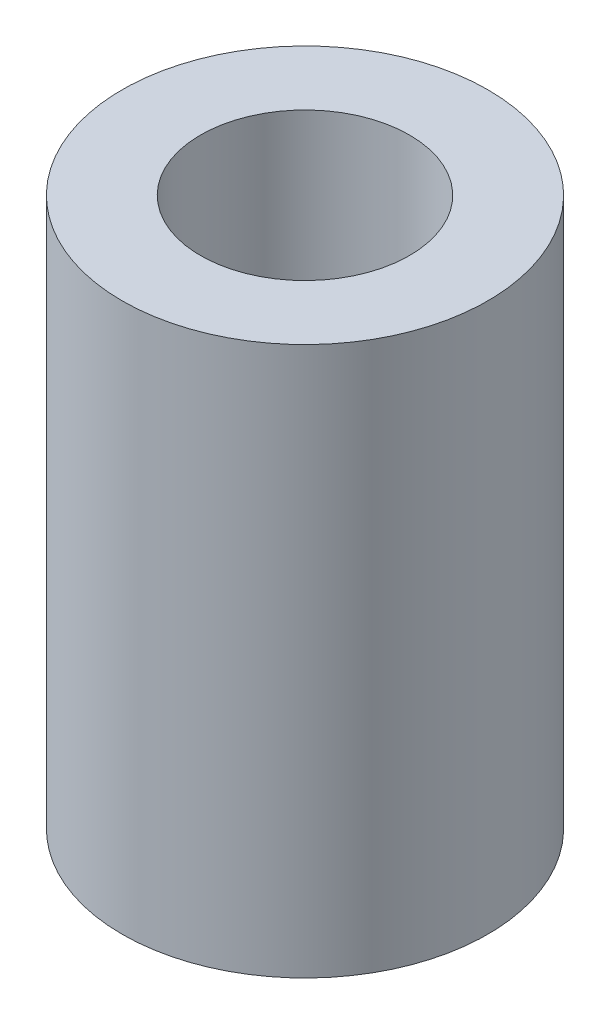
ISO-10303-21;
HEADER;
FILE_DESCRIPTION(('STEP AP214'),'2;1');
FILE_NAME('part.step','',(''),(''),'','','');
FILE_SCHEMA(('AUTOMOTIVE_DESIGN { 1 0 10303 214 1 1 1 1 }'));
ENDSEC;
DATA;
#1=APPLICATION_CONTEXT('core data for automotive mechanical design processes');
#2=APPLICATION_PROTOCOL_DEFINITION('international standard','automotive_design',2000,#1);
#3=PRODUCT_CONTEXT('',#1,'mechanical');
#4=PRODUCT('Part','Part','',(#3));
#5=PRODUCT_RELATED_PRODUCT_CATEGORY('part','',(#4));
#6=PRODUCT_DEFINITION_FORMATION('','',#4);
#7=PRODUCT_DEFINITION_CONTEXT('part definition',#1,'design');
#8=PRODUCT_DEFINITION('design','',#6,#7);
#9=PRODUCT_DEFINITION_SHAPE('','',#8);
#10=(LENGTH_UNIT() NAMED_UNIT(*) SI_UNIT(.MILLI.,.METRE.));
#11=(NAMED_UNIT(*) PLANE_ANGLE_UNIT() SI_UNIT($,.RADIAN.));
#12=(NAMED_UNIT(*) SI_UNIT($,.STERADIAN.) SOLID_ANGLE_UNIT());
#13=UNCERTAINTY_MEASURE_WITH_UNIT(LENGTH_MEASURE(1.E-05),#10,'distance_accuracy_value','');
#14=(GEOMETRIC_REPRESENTATION_CONTEXT(3) GLOBAL_UNCERTAINTY_ASSIGNED_CONTEXT((#13)) GLOBAL_UNIT_ASSIGNED_CONTEXT((#10,
#11,#12)) REPRESENTATION_CONTEXT('',''));
#15=CARTESIAN_POINT('',(0.,0.,0.));
#16=DIRECTION('',(0.,0.,1.));
#17=DIRECTION('',(1.,0.,0.));
#18=AXIS2_PLACEMENT_3D('',#15,#16,#17);
#19=CARTESIAN_POINT('',(0.,10.5,0.));
#20=DIRECTION('',(0.,1.,0.));
#21=DIRECTION('',(0.,0.,1.));
#22=AXIS2_PLACEMENT_3D('',#19,#20,#21);
#23=PLANE('',#22);
#24=CARTESIAN_POINT('',(0.,10.5,0.));
#25=DIRECTION('',(0.,1.,0.));
#26=DIRECTION('',(0.,0.,1.));
#27=AXIS2_PLACEMENT_3D('',#24,#25,#26);
#28=CIRCLE('',#27,3.5);
#29=CARTESIAN_POINT('',(0.,10.5,-3.5));
#30=VERTEX_POINT('',#29);
#31=EDGE_CURVE('E10',#30,#30,#28,.T.);
#32=ORIENTED_EDGE('',*,*,#31,.T.);
#33=EDGE_LOOP('',(#32));
#34=FACE_BOUND('',#33,.T.);
#35=CARTESIAN_POINT('',(0.,10.5,0.));
#36=DIRECTION('',(0.,1.,0.));
#37=DIRECTION('',(0.,0.,1.));
#38=AXIS2_PLACEMENT_3D('',#35,#36,#37);
#39=CIRCLE('',#38,2.);
#40=CARTESIAN_POINT('',(0.,10.5,-2.));
#41=VERTEX_POINT('',#40);
#42=EDGE_CURVE('E53',#41,#41,#39,.T.);
#43=ORIENTED_EDGE('',*,*,#42,.F.);
#44=EDGE_LOOP('',(#43));
#45=FACE_BOUND('',#44,.T.);
#46=ADVANCED_FACE('F40',(#34,#45),#23,.T.);
#47=CARTESIAN_POINT('',(0.,0.,0.));
#48=DIRECTION('',(0.,1.,0.));
#49=DIRECTION('',(0.,0.,1.));
#50=AXIS2_PLACEMENT_3D('',#47,#48,#49);
#51=PLANE('',#50);
#52=CARTESIAN_POINT('',(0.,0.,0.));
#53=DIRECTION('',(0.,1.,0.));
#54=DIRECTION('',(0.,0.,1.));
#55=AXIS2_PLACEMENT_3D('',#52,#53,#54);
#56=CIRCLE('',#55,3.5);
#57=CARTESIAN_POINT('',(0.,0.,-3.5));
#58=VERTEX_POINT('',#57);
#59=EDGE_CURVE('E44',#58,#58,#56,.T.);
#60=ORIENTED_EDGE('',*,*,#59,.F.);
#61=EDGE_LOOP('',(#60));
#62=FACE_BOUND('',#61,.T.);
#63=CARTESIAN_POINT('',(0.,0.,0.));
#64=DIRECTION('',(0.,1.,0.));
#65=DIRECTION('',(0.,0.,1.));
#66=AXIS2_PLACEMENT_3D('',#63,#64,#65);
#67=CIRCLE('',#66,2.);
#68=CARTESIAN_POINT('',(0.,0.,-2.));
#69=VERTEX_POINT('',#68);
#70=EDGE_CURVE('E55',#69,#69,#67,.T.);
#71=ORIENTED_EDGE('',*,*,#70,.T.);
#72=EDGE_LOOP('',(#71));
#73=FACE_BOUND('',#72,.T.);
#74=ADVANCED_FACE('F67',(#62,#73),#51,.F.);
#75=CARTESIAN_POINT('',(0.,10.5,0.));
#76=DIRECTION('',(0.,-1.,0.));
#77=DIRECTION('',(0.,0.,-1.));
#78=AXIS2_PLACEMENT_3D('',#75,#76,#77);
#79=CYLINDRICAL_SURFACE('',#78,3.5);
#80=CARTESIAN_POINT('',(0.,10.5,-3.5));
#81=CARTESIAN_POINT('',(0.,10.390625,-3.5));
#82=CARTESIAN_POINT('',(0.,10.28125,-3.5));
#83=CARTESIAN_POINT('',(0.,10.0625,-3.5));
#84=CARTESIAN_POINT('',(0.,9.953125,-3.5));
#85=CARTESIAN_POINT('',(0.,9.734375,-3.5));
#86=CARTESIAN_POINT('',(0.,9.625,-3.5));
#87=CARTESIAN_POINT('',(0.,9.40625,-3.5));
#88=CARTESIAN_POINT('',(0.,9.296875,-3.5));
#89=CARTESIAN_POINT('',(0.,9.078125,-3.5));
#90=CARTESIAN_POINT('',(0.,8.96875,-3.5));
#91=CARTESIAN_POINT('',(0.,8.75,-3.5));
#92=CARTESIAN_POINT('',(0.,8.640625,-3.5));
#93=CARTESIAN_POINT('',(0.,8.421875,-3.5));
#94=CARTESIAN_POINT('',(0.,8.3125,-3.5));
#95=CARTESIAN_POINT('',(0.,8.09375,-3.5));
#96=CARTESIAN_POINT('',(0.,7.984375,-3.5));
#97=CARTESIAN_POINT('',(0.,7.765625,-3.5));
#98=CARTESIAN_POINT('',(0.,7.65625,-3.5));
#99=CARTESIAN_POINT('',(0.,7.4375,-3.5));
#100=CARTESIAN_POINT('',(0.,7.328125,-3.5));
#101=CARTESIAN_POINT('',(0.,7.109375,-3.5));
#102=CARTESIAN_POINT('',(0.,7.,-3.5));
#103=CARTESIAN_POINT('',(0.,6.78125,-3.5));
#104=CARTESIAN_POINT('',(0.,6.671875,-3.5));
#105=CARTESIAN_POINT('',(0.,6.453125,-3.5));
#106=CARTESIAN_POINT('',(0.,6.34375,-3.5));
#107=CARTESIAN_POINT('',(0.,6.125,-3.5));
#108=CARTESIAN_POINT('',(0.,6.015625,-3.5));
#109=CARTESIAN_POINT('',(0.,5.796875,-3.5));
#110=CARTESIAN_POINT('',(0.,5.6875,-3.5));
#111=CARTESIAN_POINT('',(0.,5.46875,-3.5));
#112=CARTESIAN_POINT('',(0.,5.359375,-3.5));
#113=CARTESIAN_POINT('',(0.,5.140625,-3.5));
#114=CARTESIAN_POINT('',(0.,5.03125,-3.5));
#115=CARTESIAN_POINT('',(0.,4.8125,-3.5));
#116=CARTESIAN_POINT('',(0.,4.703125,-3.5));
#117=CARTESIAN_POINT('',(0.,4.484375,-3.5));
#118=CARTESIAN_POINT('',(0.,4.375,-3.5));
#119=CARTESIAN_POINT('',(0.,4.15625,-3.5));
#120=CARTESIAN_POINT('',(0.,4.046875,-3.5));
#121=CARTESIAN_POINT('',(0.,3.828125,-3.5));
#122=CARTESIAN_POINT('',(0.,3.71875,-3.5));
#123=CARTESIAN_POINT('',(0.,3.5,-3.5));
#124=CARTESIAN_POINT('',(0.,3.390625,-3.5));
#125=CARTESIAN_POINT('',(0.,3.171875,-3.5));
#126=CARTESIAN_POINT('',(0.,3.0625,-3.5));
#127=CARTESIAN_POINT('',(0.,2.84375,-3.5));
#128=CARTESIAN_POINT('',(0.,2.734375,-3.5));
#129=CARTESIAN_POINT('',(0.,2.515625,-3.5));
#130=CARTESIAN_POINT('',(0.,2.40625,-3.5));
#131=CARTESIAN_POINT('',(0.,2.1875,-3.5));
#132=CARTESIAN_POINT('',(0.,2.078125,-3.5));
#133=CARTESIAN_POINT('',(0.,1.859375,-3.5));
#134=CARTESIAN_POINT('',(0.,1.75,-3.5));
#135=CARTESIAN_POINT('',(0.,1.53125,-3.5));
#136=CARTESIAN_POINT('',(0.,1.421875,-3.5));
#137=CARTESIAN_POINT('',(0.,1.203125,-3.5));
#138=CARTESIAN_POINT('',(0.,1.09375,-3.5));
#139=CARTESIAN_POINT('',(0.,0.875000000000001,-3.5));
#140=CARTESIAN_POINT('',(0.,0.765625000000001,-3.5));
#141=CARTESIAN_POINT('',(0.,0.546875,-3.5));
#142=CARTESIAN_POINT('',(0.,0.4375,-3.5));
#143=CARTESIAN_POINT('',(0.,0.21875,-3.5));
#144=CARTESIAN_POINT('',(0.,0.109375,-3.5));
#145=CARTESIAN_POINT('',(0.,0.,-3.5));
#146=B_SPLINE_CURVE_WITH_KNOTS('',3,(#80,#81,#82,#83,#84,#85,#86,#87,#88,#89,#90,#91,#92,#93,
#94,#95,#96,#97,#98,#99,#100,#101,#102,#103,#104,#105,#106,#107,#108,#109,#110,#111,#112,#113,
#114,#115,#116,#117,#118,#119,#120,#121,#122,#123,#124,#125,#126,#127,#128,#129,#130,#131,#132,
#133,#134,#135,#136,#137,#138,#139,#140,#141,#142,#143,#144,#145),.UNSPECIFIED.,.F.,.F.,(4,2,2,
2,2,2,2,2,2,2,2,2,2,2,2,2,2,2,2,2,2,2,2,2,2,2,2,2,2,2,2,2,4),(0.,0.328124999999999,
0.656249999999999,0.984374999999999,1.3125,1.640625,1.96875,2.296875,2.625,2.953125,3.28125,
3.609375,3.9375,4.265625,4.59375,4.921875,5.25,5.578125,5.90625,6.234375,6.5625,6.890625,
7.21875,7.546875,7.875,8.203125,8.53125,8.859375,9.1875,9.515625,9.84375,10.171875,10.5),.UNSPECIFIED.);
#147=EDGE_CURVE('BSEAM42',#30,#58,#146,.T.);
#148=ORIENTED_EDGE('',*,*,#31,.F.);
#149=ORIENTED_EDGE('',*,*,#59,.T.);
#150=ORIENTED_EDGE('',*,*,#147,.T.);
#151=ORIENTED_EDGE('',*,*,#147,.F.);
#152=EDGE_LOOP('',(#148,#150,#149,#151));
#153=FACE_BOUND('',#152,.T.);
#154=ADVANCED_FACE('F42',(#153),#79,.T.);
#155=CARTESIAN_POINT('',(0.,10.5,0.));
#156=DIRECTION('',(0.,-1.,0.));
#157=DIRECTION('',(0.,0.,-1.));
#158=AXIS2_PLACEMENT_3D('',#155,#156,#157);
#159=CYLINDRICAL_SURFACE('',#158,2.);
#160=CARTESIAN_POINT('',(0.,10.5,-2.));
#161=CARTESIAN_POINT('',(0.,10.390625,-2.));
#162=CARTESIAN_POINT('',(0.,10.28125,-2.));
#163=CARTESIAN_POINT('',(0.,10.0625,-2.));
#164=CARTESIAN_POINT('',(0.,9.953125,-2.));
#165=CARTESIAN_POINT('',(0.,9.734375,-2.));
#166=CARTESIAN_POINT('',(0.,9.625,-2.));
#167=CARTESIAN_POINT('',(0.,9.40625,-2.));
#168=CARTESIAN_POINT('',(0.,9.296875,-2.));
#169=CARTESIAN_POINT('',(0.,9.078125,-2.));
#170=CARTESIAN_POINT('',(0.,8.96875,-2.));
#171=CARTESIAN_POINT('',(0.,8.75,-2.));
#172=CARTESIAN_POINT('',(0.,8.640625,-2.));
#173=CARTESIAN_POINT('',(0.,8.421875,-2.));
#174=CARTESIAN_POINT('',(0.,8.3125,-2.));
#175=CARTESIAN_POINT('',(0.,8.09375,-2.));
#176=CARTESIAN_POINT('',(0.,7.984375,-2.));
#177=CARTESIAN_POINT('',(0.,7.765625,-2.));
#178=CARTESIAN_POINT('',(0.,7.65625,-2.));
#179=CARTESIAN_POINT('',(0.,7.4375,-2.));
#180=CARTESIAN_POINT('',(0.,7.328125,-2.));
#181=CARTESIAN_POINT('',(0.,7.109375,-2.));
#182=CARTESIAN_POINT('',(0.,7.,-2.));
#183=CARTESIAN_POINT('',(0.,6.78125,-2.));
#184=CARTESIAN_POINT('',(0.,6.671875,-2.));
#185=CARTESIAN_POINT('',(0.,6.453125,-2.));
#186=CARTESIAN_POINT('',(0.,6.34375,-2.));
#187=CARTESIAN_POINT('',(0.,6.125,-2.));
#188=CARTESIAN_POINT('',(0.,6.015625,-2.));
#189=CARTESIAN_POINT('',(0.,5.796875,-2.));
#190=CARTESIAN_POINT('',(0.,5.6875,-2.));
#191=CARTESIAN_POINT('',(0.,5.46875,-2.));
#192=CARTESIAN_POINT('',(0.,5.359375,-2.));
#193=CARTESIAN_POINT('',(0.,5.140625,-2.));
#194=CARTESIAN_POINT('',(0.,5.03125,-2.));
#195=CARTESIAN_POINT('',(0.,4.8125,-2.));
#196=CARTESIAN_POINT('',(0.,4.703125,-2.));
#197=CARTESIAN_POINT('',(0.,4.484375,-2.));
#198=CARTESIAN_POINT('',(0.,4.375,-2.));
#199=CARTESIAN_POINT('',(0.,4.15625,-2.));
#200=CARTESIAN_POINT('',(0.,4.046875,-2.));
#201=CARTESIAN_POINT('',(0.,3.828125,-2.));
#202=CARTESIAN_POINT('',(0.,3.71875,-2.));
#203=CARTESIAN_POINT('',(0.,3.5,-2.));
#204=CARTESIAN_POINT('',(0.,3.390625,-2.));
#205=CARTESIAN_POINT('',(0.,3.171875,-2.));
#206=CARTESIAN_POINT('',(0.,3.0625,-2.));
#207=CARTESIAN_POINT('',(0.,2.84375,-2.));
#208=CARTESIAN_POINT('',(0.,2.734375,-2.));
#209=CARTESIAN_POINT('',(0.,2.515625,-2.));
#210=CARTESIAN_POINT('',(0.,2.40625,-2.));
#211=CARTESIAN_POINT('',(0.,2.1875,-2.));
#212=CARTESIAN_POINT('',(0.,2.078125,-2.));
#213=CARTESIAN_POINT('',(0.,1.859375,-2.));
#214=CARTESIAN_POINT('',(0.,1.75,-2.));
#215=CARTESIAN_POINT('',(0.,1.53125,-2.));
#216=CARTESIAN_POINT('',(0.,1.421875,-2.));
#217=CARTESIAN_POINT('',(0.,1.203125,-2.));
#218=CARTESIAN_POINT('',(0.,1.09375,-2.));
#219=CARTESIAN_POINT('',(0.,0.875000000000001,-2.));
#220=CARTESIAN_POINT('',(0.,0.765625000000001,-2.));
#221=CARTESIAN_POINT('',(0.,0.546875,-2.));
#222=CARTESIAN_POINT('',(0.,0.4375,-2.));
#223=CARTESIAN_POINT('',(0.,0.21875,-2.));
#224=CARTESIAN_POINT('',(0.,0.109375,-2.));
#225=CARTESIAN_POINT('',(0.,0.,-2.));
#226=B_SPLINE_CURVE_WITH_KNOTS('',3,(#160,#161,#162,#163,#164,#165,#166,#167,#168,#169,#170,
#171,#172,#173,#174,#175,#176,#177,#178,#179,#180,#181,#182,#183,#184,#185,#186,#187,#188,#189,
#190,#191,#192,#193,#194,#195,#196,#197,#198,#199,#200,#201,#202,#203,#204,#205,#206,#207,#208,
#209,#210,#211,#212,#213,#214,#215,#216,#217,#218,#219,#220,#221,#222,#223,#224,#225),
.UNSPECIFIED.,.F.,.F.,(4,2,2,2,2,2,2,2,2,2,2,2,2,2,2,2,2,2,2,2,2,2,2,2,2,2,2,2,2,2,2,2,4),(0.,
0.328124999999999,0.656249999999999,0.984374999999999,1.3125,1.640625,1.96875,2.296875,2.625,
2.953125,3.28125,3.609375,3.9375,4.265625,4.59375,4.921875,5.25,5.578125,5.90625,6.234375,
6.5625,6.890625,7.21875,7.546875,7.875,8.203125,8.53125,8.859375,9.1875,9.515625,9.84375,
10.171875,10.5),.UNSPECIFIED.);
#227=EDGE_CURVE('BSEAM63',#41,#69,#226,.T.);
#228=ORIENTED_EDGE('',*,*,#42,.T.);
#229=ORIENTED_EDGE('',*,*,#70,.F.);
#230=ORIENTED_EDGE('',*,*,#227,.T.);
#231=ORIENTED_EDGE('',*,*,#227,.F.);
#232=EDGE_LOOP('',(#228,#230,#229,#231));
#233=FACE_BOUND('',#232,.T.);
#234=ADVANCED_FACE('F63',(#233),#159,.F.);
#235=CLOSED_SHELL('',(#46,#74,#154,#234));
#236=MANIFOLD_SOLID_BREP('B2',#235);
#237=ADVANCED_BREP_SHAPE_REPRESENTATION('',(#18,#236),#14);
#238=SHAPE_DEFINITION_REPRESENTATION(#9,#237);
ENDSEC;
END-ISO-10303-21;
